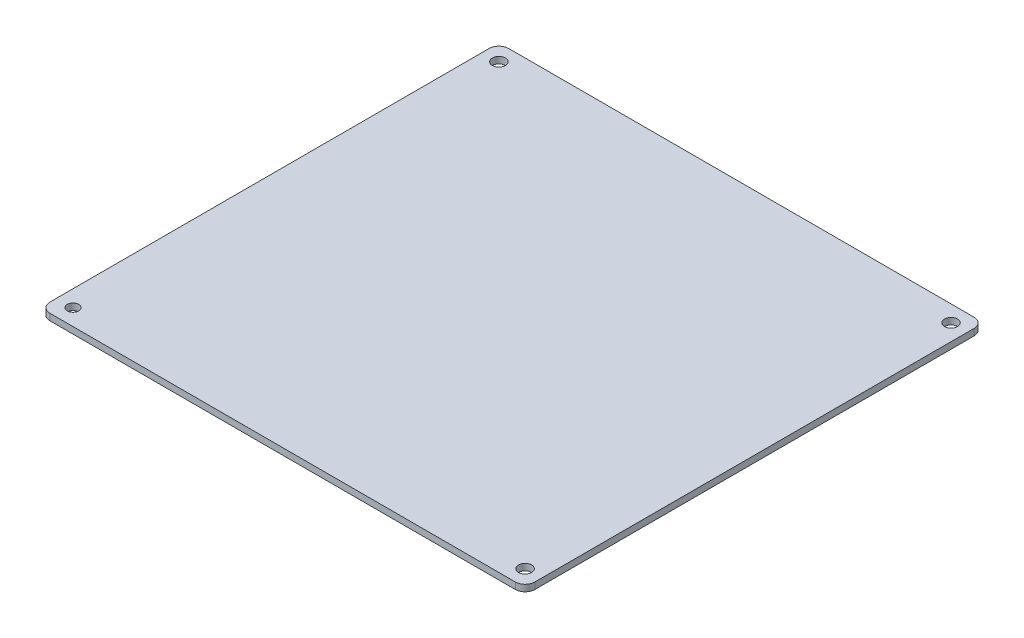
ISO-10303-21;
HEADER;
FILE_DESCRIPTION(('STEP AP214'),'2;1');
FILE_NAME('part.step','',(''),(''),'','','');
FILE_SCHEMA(('AUTOMOTIVE_DESIGN { 1 0 10303 214 1 1 1 1 }'));
ENDSEC;
DATA;
#1=APPLICATION_CONTEXT('core data for automotive mechanical design processes');
#2=APPLICATION_PROTOCOL_DEFINITION('international standard','automotive_design',2000,#1);
#3=PRODUCT_CONTEXT('',#1,'mechanical');
#4=PRODUCT('Part','Part','',(#3));
#5=PRODUCT_RELATED_PRODUCT_CATEGORY('part','',(#4));
#6=PRODUCT_DEFINITION_FORMATION('','',#4);
#7=PRODUCT_DEFINITION_CONTEXT('part definition',#1,'design');
#8=PRODUCT_DEFINITION('design','',#6,#7);
#9=PRODUCT_DEFINITION_SHAPE('','',#8);
#10=(LENGTH_UNIT() NAMED_UNIT(*) SI_UNIT(.MILLI.,.METRE.));
#11=(NAMED_UNIT(*) PLANE_ANGLE_UNIT() SI_UNIT($,.RADIAN.));
#12=(NAMED_UNIT(*) SI_UNIT($,.STERADIAN.) SOLID_ANGLE_UNIT());
#13=UNCERTAINTY_MEASURE_WITH_UNIT(LENGTH_MEASURE(1.E-05),#10,'distance_accuracy_value','');
#14=(GEOMETRIC_REPRESENTATION_CONTEXT(3) GLOBAL_UNCERTAINTY_ASSIGNED_CONTEXT((#13)) GLOBAL_UNIT_ASSIGNED_CONTEXT((#10,
#11,#12)) REPRESENTATION_CONTEXT('',''));
#15=CARTESIAN_POINT('',(0.,0.,0.));
#16=DIRECTION('',(0.,0.,1.));
#17=DIRECTION('',(1.,0.,0.));
#18=AXIS2_PLACEMENT_3D('',#15,#16,#17);
#19=CARTESIAN_POINT('',(86.9141470098578,2.,-137.76397382956));
#20=DIRECTION('',(-1.,0.,0.));
#21=DIRECTION('',(0.,0.,1.));
#22=AXIS2_PLACEMENT_3D('',#19,#20,#21);
#23=PLANE('',#22);
#24=DIRECTION('',(0.,0.,-1.));
#25=VECTOR('',#24,1.);
#26=CARTESIAN_POINT('',(86.9141470098578,0.,-137.76397382956));
#27=LINE('',#26,#25);
#28=CARTESIAN_POINT('',(86.9141470098578,0.,-0.763973829560338));
#29=VERTEX_POINT('',#28);
#30=CARTESIAN_POINT('',(86.9141470098578,0.,-134.76397382956));
#31=VERTEX_POINT('',#30);
#32=EDGE_CURVE('E119',#29,#31,#27,.T.);
#33=ORIENTED_EDGE('',*,*,#32,.T.);
#34=DIRECTION('',(0.,-1.,0.));
#35=VECTOR('',#34,1.);
#36=CARTESIAN_POINT('',(86.9141470098578,2.,-134.76397382956));
#37=LINE('',#36,#35);
#38=CARTESIAN_POINT('',(86.9141470098578,2.,-134.76397382956));
#39=VERTEX_POINT('',#38);
#40=EDGE_CURVE('E172',#31,#39,#37,.F.);
#41=ORIENTED_EDGE('',*,*,#40,.T.);
#42=DIRECTION('',(0.,0.,-1.));
#43=VECTOR('',#42,1.);
#44=CARTESIAN_POINT('',(86.9141470098578,2.,-137.76397382956));
#45=LINE('',#44,#43);
#46=CARTESIAN_POINT('',(86.9141470098578,2.,-0.763973829560338));
#47=VERTEX_POINT('',#46);
#48=EDGE_CURVE('E122',#47,#39,#45,.T.);
#49=ORIENTED_EDGE('',*,*,#48,.F.);
#50=DIRECTION('',(0.,-1.,0.));
#51=VECTOR('',#50,1.);
#52=CARTESIAN_POINT('',(86.9141470098578,2.,-0.763973829560338));
#53=LINE('',#52,#51);
#54=EDGE_CURVE('E110',#47,#29,#53,.T.);
#55=ORIENTED_EDGE('',*,*,#54,.T.);
#56=EDGE_LOOP('',(#33,#41,#49,#55));
#57=FACE_BOUND('',#56,.T.);
#58=ADVANCED_FACE('F39',(#57),#23,.F.);
#59=CARTESIAN_POINT('',(86.9141470098578,2.,-137.76397382956));
#60=DIRECTION('',(0.,0.,1.));
#61=DIRECTION('',(1.,0.,0.));
#62=AXIS2_PLACEMENT_3D('',#59,#60,#61);
#63=PLANE('',#62);
#64=DIRECTION('',(-1.,0.,0.));
#65=VECTOR('',#64,1.);
#66=CARTESIAN_POINT('',(86.9141470098578,0.,-137.76397382956));
#67=LINE('',#66,#65);
#68=CARTESIAN_POINT('',(83.9141470098578,0.,-137.76397382956));
#69=VERTEX_POINT('',#68);
#70=CARTESIAN_POINT('',(-58.0858529901422,0.,-137.76397382956));
#71=VERTEX_POINT('',#70);
#72=EDGE_CURVE('E130',#69,#71,#67,.T.);
#73=ORIENTED_EDGE('',*,*,#72,.T.);
#74=DIRECTION('',(0.,-1.,0.));
#75=VECTOR('',#74,1.);
#76=CARTESIAN_POINT('',(-58.0858529901422,2.,-137.76397382956));
#77=LINE('',#76,#75);
#78=CARTESIAN_POINT('',(-58.0858529901422,2.,-137.76397382956));
#79=VERTEX_POINT('',#78);
#80=EDGE_CURVE('E185',#71,#79,#77,.F.);
#81=ORIENTED_EDGE('',*,*,#80,.T.);
#82=DIRECTION('',(-1.,0.,0.));
#83=VECTOR('',#82,1.);
#84=CARTESIAN_POINT('',(86.9141470098578,2.,-137.76397382956));
#85=LINE('',#84,#83);
#86=CARTESIAN_POINT('',(83.9141470098578,2.,-137.76397382956));
#87=VERTEX_POINT('',#86);
#88=EDGE_CURVE('E201',#87,#79,#85,.T.);
#89=ORIENTED_EDGE('',*,*,#88,.F.);
#90=DIRECTION('',(0.,-1.,0.));
#91=VECTOR('',#90,1.);
#92=CARTESIAN_POINT('',(83.9141470098578,2.,-137.76397382956));
#93=LINE('',#92,#91);
#94=EDGE_CURVE('E166',#87,#69,#93,.T.);
#95=ORIENTED_EDGE('',*,*,#94,.T.);
#96=EDGE_LOOP('',(#73,#81,#89,#95));
#97=FACE_BOUND('',#96,.T.);
#98=ADVANCED_FACE('F247',(#97),#63,.F.);
#99=CARTESIAN_POINT('',(-61.0858529901422,2.,-137.76397382956));
#100=DIRECTION('',(1.,0.,0.));
#101=DIRECTION('',(0.,0.,-1.));
#102=AXIS2_PLACEMENT_3D('',#99,#100,#101);
#103=PLANE('',#102);
#104=DIRECTION('',(0.,0.,1.));
#105=VECTOR('',#104,1.);
#106=CARTESIAN_POINT('',(-61.0858529901422,0.,-137.76397382956));
#107=LINE('',#106,#105);
#108=CARTESIAN_POINT('',(-61.0858529901422,0.,-134.76397382956));
#109=VERTEX_POINT('',#108);
#110=CARTESIAN_POINT('',(-61.0858529901422,0.,-0.763973829560283));
#111=VERTEX_POINT('',#110);
#112=EDGE_CURVE('E136',#109,#111,#107,.T.);
#113=ORIENTED_EDGE('',*,*,#112,.T.);
#114=DIRECTION('',(0.,-1.,0.));
#115=VECTOR('',#114,1.);
#116=CARTESIAN_POINT('',(-61.0858529901422,2.,-0.763973829560283));
#117=LINE('',#116,#115);
#118=CARTESIAN_POINT('',(-61.0858529901422,2.,-0.763973829560283));
#119=VERTEX_POINT('',#118);
#120=EDGE_CURVE('E48',#111,#119,#117,.F.);
#121=ORIENTED_EDGE('',*,*,#120,.T.);
#122=DIRECTION('',(0.,0.,1.));
#123=VECTOR('',#122,1.);
#124=CARTESIAN_POINT('',(-61.0858529901422,2.,-137.76397382956));
#125=LINE('',#124,#123);
#126=CARTESIAN_POINT('',(-61.0858529901422,2.,-134.76397382956));
#127=VERTEX_POINT('',#126);
#128=EDGE_CURVE('E199',#127,#119,#125,.T.);
#129=ORIENTED_EDGE('',*,*,#128,.F.);
#130=DIRECTION('',(0.,-1.,0.));
#131=VECTOR('',#130,1.);
#132=CARTESIAN_POINT('',(-61.0858529901422,2.,-134.76397382956));
#133=LINE('',#132,#131);
#134=EDGE_CURVE('E178',#127,#109,#133,.T.);
#135=ORIENTED_EDGE('',*,*,#134,.T.);
#136=EDGE_LOOP('',(#113,#121,#129,#135));
#137=FACE_BOUND('',#136,.T.);
#138=ADVANCED_FACE('F242',(#137),#103,.F.);
#139=CARTESIAN_POINT('',(86.9141470098578,2.,2.23602617043966));
#140=DIRECTION('',(0.,0.,-1.));
#141=DIRECTION('',(-1.,0.,0.));
#142=AXIS2_PLACEMENT_3D('',#139,#140,#141);
#143=PLANE('',#142);
#144=DIRECTION('',(1.,0.,0.));
#145=VECTOR('',#144,1.);
#146=CARTESIAN_POINT('',(86.9141470098578,2.,2.23602617043966));
#147=LINE('',#146,#145);
#148=CARTESIAN_POINT('',(-58.0858529901422,2.,2.23602617043972));
#149=VERTEX_POINT('',#148);
#150=CARTESIAN_POINT('',(83.9141470098578,2.,2.23602617043967));
#151=VERTEX_POINT('',#150);
#152=EDGE_CURVE('E124',#149,#151,#147,.T.);
#153=ORIENTED_EDGE('',*,*,#152,.F.);
#154=DIRECTION('',(0.,-1.,0.));
#155=VECTOR('',#154,1.);
#156=CARTESIAN_POINT('',(-58.0858529901422,2.,2.23602617043972));
#157=LINE('',#156,#155);
#158=CARTESIAN_POINT('',(-58.0858529901422,0.,2.23602617043972));
#159=VERTEX_POINT('',#158);
#160=EDGE_CURVE('E191',#149,#159,#157,.T.);
#161=ORIENTED_EDGE('',*,*,#160,.T.);
#162=DIRECTION('',(1.,0.,0.));
#163=VECTOR('',#162,1.);
#164=CARTESIAN_POINT('',(86.9141470098578,0.,2.23602617043966));
#165=LINE('',#164,#163);
#166=CARTESIAN_POINT('',(83.9141470098578,0.,2.23602617043967));
#167=VERTEX_POINT('',#166);
#168=EDGE_CURVE('E146',#159,#167,#165,.T.);
#169=ORIENTED_EDGE('',*,*,#168,.T.);
#170=DIRECTION('',(0.,-1.,0.));
#171=VECTOR('',#170,1.);
#172=CARTESIAN_POINT('',(83.9141470098578,2.,2.23602617043967));
#173=LINE('',#172,#171);
#174=EDGE_CURVE('E112',#167,#151,#173,.F.);
#175=ORIENTED_EDGE('',*,*,#174,.T.);
#176=EDGE_LOOP('',(#153,#161,#169,#175));
#177=FACE_BOUND('',#176,.T.);
#178=ADVANCED_FACE('F230',(#177),#143,.F.);
#179=CARTESIAN_POINT('',(0.,2.,0.));
#180=DIRECTION('',(0.,-1.,0.));
#181=DIRECTION('',(0.,0.,-1.));
#182=AXIS2_PLACEMENT_3D('',#179,#180,#181);
#183=PLANE('',#182);
#184=CARTESIAN_POINT('',(-56.0858529901422,2.,-2.76397382956028));
#185=DIRECTION('',(0.,1.,0.));
#186=DIRECTION('',(0.,0.,1.));
#187=AXIS2_PLACEMENT_3D('',#184,#185,#186);
#188=CIRCLE('',#187,1.73874997043389);
#189=CARTESIAN_POINT('',(-56.0858529901422,2.,-1.02522385912639));
#190=VERTEX_POINT('',#189);
#191=EDGE_CURVE('E213',#190,#190,#188,.T.);
#192=ORIENTED_EDGE('',*,*,#191,.F.);
#193=EDGE_LOOP('',(#192));
#194=FACE_BOUND('',#193,.T.);
#195=CARTESIAN_POINT('',(81.9141470098578,2.,-2.76397382956028));
#196=DIRECTION('',(0.,1.,0.));
#197=DIRECTION('',(0.,0.,1.));
#198=AXIS2_PLACEMENT_3D('',#195,#196,#197);
#199=CIRCLE('',#198,2.);
#200=CARTESIAN_POINT('',(81.9141470098578,2.,-0.763973829560284));
#201=VERTEX_POINT('',#200);
#202=EDGE_CURVE('E217',#201,#201,#199,.T.);
#203=ORIENTED_EDGE('',*,*,#202,.F.);
#204=EDGE_LOOP('',(#203));
#205=FACE_BOUND('',#204,.T.);
#206=CARTESIAN_POINT('',(81.9141470098578,2.,-132.76397382956));
#207=DIRECTION('',(0.,1.,0.));
#208=DIRECTION('',(0.,0.,1.));
#209=AXIS2_PLACEMENT_3D('',#206,#207,#208);
#210=CIRCLE('',#209,2.);
#211=CARTESIAN_POINT('',(81.9141470098578,2.,-130.76397382956));
#212=VERTEX_POINT('',#211);
#213=EDGE_CURVE('E212',#212,#212,#210,.T.);
#214=ORIENTED_EDGE('',*,*,#213,.F.);
#215=EDGE_LOOP('',(#214));
#216=FACE_BOUND('',#215,.T.);
#217=CARTESIAN_POINT('',(-56.0858529901422,2.,-132.76397382956));
#218=DIRECTION('',(0.,1.,0.));
#219=DIRECTION('',(0.,0.,1.));
#220=AXIS2_PLACEMENT_3D('',#217,#218,#219);
#221=CIRCLE('',#220,2.);
#222=CARTESIAN_POINT('',(-56.0858529901422,2.,-130.76397382956));
#223=VERTEX_POINT('',#222);
#224=EDGE_CURVE('E154',#223,#223,#221,.T.);
#225=ORIENTED_EDGE('',*,*,#224,.F.);
#226=EDGE_LOOP('',(#225));
#227=FACE_BOUND('',#226,.T.);
#228=ORIENTED_EDGE('',*,*,#128,.T.);
#229=CARTESIAN_POINT('',(-58.0858529901422,2.,-0.763973829560281));
#230=DIRECTION('',(0.,-1.,0.));
#231=DIRECTION('',(0.,0.,-1.));
#232=AXIS2_PLACEMENT_3D('',#229,#230,#231);
#233=CIRCLE('',#232,3.);
#234=EDGE_CURVE('E11',#119,#149,#233,.F.);
#235=ORIENTED_EDGE('',*,*,#234,.T.);
#236=ORIENTED_EDGE('',*,*,#152,.T.);
#237=CARTESIAN_POINT('',(83.9141470098578,2.,-0.763973829560338));
#238=DIRECTION('',(0.,-1.,0.));
#239=DIRECTION('',(0.,0.,-1.));
#240=AXIS2_PLACEMENT_3D('',#237,#238,#239);
#241=CIRCLE('',#240,3.);
#242=EDGE_CURVE('E163',#151,#47,#241,.F.);
#243=ORIENTED_EDGE('',*,*,#242,.T.);
#244=ORIENTED_EDGE('',*,*,#48,.T.);
#245=CARTESIAN_POINT('',(83.9141470098578,2.,-134.76397382956));
#246=DIRECTION('',(0.,-1.,0.));
#247=DIRECTION('',(0.,0.,-1.));
#248=AXIS2_PLACEMENT_3D('',#245,#246,#247);
#249=CIRCLE('',#248,3.);
#250=EDGE_CURVE('E175',#39,#87,#249,.F.);
#251=ORIENTED_EDGE('',*,*,#250,.T.);
#252=ORIENTED_EDGE('',*,*,#88,.T.);
#253=CARTESIAN_POINT('',(-58.0858529901422,2.,-134.76397382956));
#254=DIRECTION('',(0.,-1.,0.));
#255=DIRECTION('',(0.,0.,-1.));
#256=AXIS2_PLACEMENT_3D('',#253,#254,#255);
#257=CIRCLE('',#256,3.);
#258=EDGE_CURVE('E188',#79,#127,#257,.F.);
#259=ORIENTED_EDGE('',*,*,#258,.T.);
#260=EDGE_LOOP('',(#228,#235,#236,#243,#244,#251,#252,#259));
#261=FACE_BOUND('',#260,.T.);
#262=ADVANCED_FACE('F227',(#194,#205,#216,#227,#261),#183,.F.);
#263=CARTESIAN_POINT('',(0.,0.,0.));
#264=DIRECTION('',(0.,-1.,0.));
#265=DIRECTION('',(0.,0.,-1.));
#266=AXIS2_PLACEMENT_3D('',#263,#264,#265);
#267=PLANE('',#266);
#268=CARTESIAN_POINT('',(-56.0858529901422,0.,-2.76397382956028));
#269=DIRECTION('',(0.,-1.,0.));
#270=DIRECTION('',(0.,0.,-1.));
#271=AXIS2_PLACEMENT_3D('',#268,#269,#270);
#272=CIRCLE('',#271,1.73874997043389);
#273=CARTESIAN_POINT('',(-56.0858529901422,0.,-4.50272379999417));
#274=VERTEX_POINT('',#273);
#275=EDGE_CURVE('E131',#274,#274,#272,.T.);
#276=ORIENTED_EDGE('',*,*,#275,.F.);
#277=EDGE_LOOP('',(#276));
#278=FACE_BOUND('',#277,.T.);
#279=CARTESIAN_POINT('',(81.9141470098578,0.,-2.76397382956028));
#280=DIRECTION('',(0.,-1.,0.));
#281=DIRECTION('',(0.,0.,-1.));
#282=AXIS2_PLACEMENT_3D('',#279,#280,#281);
#283=CIRCLE('',#282,2.);
#284=CARTESIAN_POINT('',(81.9141470098578,0.,-4.76397382956028));
#285=VERTEX_POINT('',#284);
#286=EDGE_CURVE('E139',#285,#285,#283,.T.);
#287=ORIENTED_EDGE('',*,*,#286,.F.);
#288=EDGE_LOOP('',(#287));
#289=FACE_BOUND('',#288,.T.);
#290=CARTESIAN_POINT('',(81.9141470098578,0.,-132.76397382956));
#291=DIRECTION('',(0.,-1.,0.));
#292=DIRECTION('',(0.,0.,-1.));
#293=AXIS2_PLACEMENT_3D('',#290,#291,#292);
#294=CIRCLE('',#293,2.);
#295=CARTESIAN_POINT('',(81.9141470098578,0.,-134.76397382956));
#296=VERTEX_POINT('',#295);
#297=EDGE_CURVE('E153',#296,#296,#294,.T.);
#298=ORIENTED_EDGE('',*,*,#297,.F.);
#299=EDGE_LOOP('',(#298));
#300=FACE_BOUND('',#299,.T.);
#301=CARTESIAN_POINT('',(-56.0858529901422,0.,-132.76397382956));
#302=DIRECTION('',(0.,-1.,0.));
#303=DIRECTION('',(0.,0.,-1.));
#304=AXIS2_PLACEMENT_3D('',#301,#302,#303);
#305=CIRCLE('',#304,2.);
#306=CARTESIAN_POINT('',(-56.0858529901422,0.,-134.76397382956));
#307=VERTEX_POINT('',#306);
#308=EDGE_CURVE('E149',#307,#307,#305,.T.);
#309=ORIENTED_EDGE('',*,*,#308,.F.);
#310=EDGE_LOOP('',(#309));
#311=FACE_BOUND('',#310,.T.);
#312=ORIENTED_EDGE('',*,*,#168,.F.);
#313=CARTESIAN_POINT('',(-58.0858529901422,0.,-0.763973829560281));
#314=DIRECTION('',(0.,-1.,0.));
#315=DIRECTION('',(0.,0.,-1.));
#316=AXIS2_PLACEMENT_3D('',#313,#314,#315);
#317=CIRCLE('',#316,3.);
#318=EDGE_CURVE('E62',#159,#111,#317,.T.);
#319=ORIENTED_EDGE('',*,*,#318,.T.);
#320=ORIENTED_EDGE('',*,*,#112,.F.);
#321=CARTESIAN_POINT('',(-58.0858529901422,0.,-134.76397382956));
#322=DIRECTION('',(0.,-1.,0.));
#323=DIRECTION('',(0.,0.,-1.));
#324=AXIS2_PLACEMENT_3D('',#321,#322,#323);
#325=CIRCLE('',#324,3.);
#326=EDGE_CURVE('E182',#109,#71,#325,.T.);
#327=ORIENTED_EDGE('',*,*,#326,.T.);
#328=ORIENTED_EDGE('',*,*,#72,.F.);
#329=CARTESIAN_POINT('',(83.9141470098578,0.,-134.76397382956));
#330=DIRECTION('',(0.,-1.,0.));
#331=DIRECTION('',(0.,0.,-1.));
#332=AXIS2_PLACEMENT_3D('',#329,#330,#331);
#333=CIRCLE('',#332,3.);
#334=EDGE_CURVE('E128',#69,#31,#333,.T.);
#335=ORIENTED_EDGE('',*,*,#334,.T.);
#336=ORIENTED_EDGE('',*,*,#32,.F.);
#337=CARTESIAN_POINT('',(83.9141470098578,0.,-0.763973829560338));
#338=DIRECTION('',(0.,-1.,0.));
#339=DIRECTION('',(0.,0.,-1.));
#340=AXIS2_PLACEMENT_3D('',#337,#338,#339);
#341=CIRCLE('',#340,3.);
#342=EDGE_CURVE('E106',#29,#167,#341,.T.);
#343=ORIENTED_EDGE('',*,*,#342,.T.);
#344=EDGE_LOOP('',(#312,#319,#320,#327,#328,#335,#336,#343));
#345=FACE_BOUND('',#344,.T.);
#346=ADVANCED_FACE('F126',(#278,#289,#300,#311,#345),#267,.T.);
#347=CARTESIAN_POINT('',(-56.0858529901422,-3.,-132.76397382956));
#348=DIRECTION('',(0.,1.,0.));
#349=DIRECTION('',(0.,0.,1.));
#350=AXIS2_PLACEMENT_3D('',#347,#348,#349);
#351=CYLINDRICAL_SURFACE('',#350,2.);
#352=ORIENTED_EDGE('',*,*,#308,.T.);
#353=EDGE_LOOP('',(#352));
#354=FACE_BOUND('',#353,.T.);
#355=ORIENTED_EDGE('',*,*,#224,.T.);
#356=EDGE_LOOP('',(#355));
#357=FACE_BOUND('',#356,.T.);
#358=ADVANCED_FACE('F285',(#354,#357),#351,.F.);
#359=CARTESIAN_POINT('',(81.9141470098578,-3.,-132.76397382956));
#360=DIRECTION('',(0.,1.,0.));
#361=DIRECTION('',(0.,0.,1.));
#362=AXIS2_PLACEMENT_3D('',#359,#360,#361);
#363=CYLINDRICAL_SURFACE('',#362,2.);
#364=ORIENTED_EDGE('',*,*,#297,.T.);
#365=EDGE_LOOP('',(#364));
#366=FACE_BOUND('',#365,.T.);
#367=ORIENTED_EDGE('',*,*,#213,.T.);
#368=EDGE_LOOP('',(#367));
#369=FACE_BOUND('',#368,.T.);
#370=ADVANCED_FACE('F225',(#366,#369),#363,.F.);
#371=CARTESIAN_POINT('',(81.9141470098578,-3.,-2.76397382956028));
#372=DIRECTION('',(0.,1.,0.));
#373=DIRECTION('',(0.,0.,1.));
#374=AXIS2_PLACEMENT_3D('',#371,#372,#373);
#375=CYLINDRICAL_SURFACE('',#374,2.);
#376=ORIENTED_EDGE('',*,*,#286,.T.);
#377=EDGE_LOOP('',(#376));
#378=FACE_BOUND('',#377,.T.);
#379=ORIENTED_EDGE('',*,*,#202,.T.);
#380=EDGE_LOOP('',(#379));
#381=FACE_BOUND('',#380,.T.);
#382=ADVANCED_FACE('F337',(#378,#381),#375,.F.);
#383=CARTESIAN_POINT('',(-56.0858529901422,-3.,-2.76397382956028));
#384=DIRECTION('',(0.,1.,0.));
#385=DIRECTION('',(0.,0.,1.));
#386=AXIS2_PLACEMENT_3D('',#383,#384,#385);
#387=CYLINDRICAL_SURFACE('',#386,1.73874997043389);
#388=ORIENTED_EDGE('',*,*,#275,.T.);
#389=EDGE_LOOP('',(#388));
#390=FACE_BOUND('',#389,.T.);
#391=ORIENTED_EDGE('',*,*,#191,.T.);
#392=EDGE_LOOP('',(#391));
#393=FACE_BOUND('',#392,.T.);
#394=ADVANCED_FACE('F261',(#390,#393),#387,.F.);
#395=CARTESIAN_POINT('',(83.9141470098578,2.,-0.763973829560338));
#396=DIRECTION('',(0.,-1.,0.));
#397=DIRECTION('',(0.,0.,-1.));
#398=AXIS2_PLACEMENT_3D('',#395,#396,#397);
#399=CYLINDRICAL_SURFACE('',#398,3.);
#400=ORIENTED_EDGE('',*,*,#242,.F.);
#401=ORIENTED_EDGE('',*,*,#174,.F.);
#402=ORIENTED_EDGE('',*,*,#342,.F.);
#403=ORIENTED_EDGE('',*,*,#54,.F.);
#404=EDGE_LOOP('',(#400,#401,#402,#403));
#405=FACE_BOUND('',#404,.T.);
#406=ADVANCED_FACE('F109',(#405),#399,.T.);
#407=CARTESIAN_POINT('',(83.9141470098578,2.,-134.76397382956));
#408=DIRECTION('',(0.,-1.,0.));
#409=DIRECTION('',(0.,0.,-1.));
#410=AXIS2_PLACEMENT_3D('',#407,#408,#409);
#411=CYLINDRICAL_SURFACE('',#410,3.);
#412=ORIENTED_EDGE('',*,*,#250,.F.);
#413=ORIENTED_EDGE('',*,*,#40,.F.);
#414=ORIENTED_EDGE('',*,*,#334,.F.);
#415=ORIENTED_EDGE('',*,*,#94,.F.);
#416=EDGE_LOOP('',(#412,#413,#414,#415));
#417=FACE_BOUND('',#416,.T.);
#418=ADVANCED_FACE('F260',(#417),#411,.T.);
#419=CARTESIAN_POINT('',(-58.0858529901422,2.,-134.76397382956));
#420=DIRECTION('',(0.,-1.,0.));
#421=DIRECTION('',(0.,0.,-1.));
#422=AXIS2_PLACEMENT_3D('',#419,#420,#421);
#423=CYLINDRICAL_SURFACE('',#422,3.);
#424=ORIENTED_EDGE('',*,*,#258,.F.);
#425=ORIENTED_EDGE('',*,*,#80,.F.);
#426=ORIENTED_EDGE('',*,*,#326,.F.);
#427=ORIENTED_EDGE('',*,*,#134,.F.);
#428=EDGE_LOOP('',(#424,#425,#426,#427));
#429=FACE_BOUND('',#428,.T.);
#430=ADVANCED_FACE('F263',(#429),#423,.T.);
#431=CARTESIAN_POINT('',(-58.0858529901422,2.,-0.763973829560281));
#432=DIRECTION('',(0.,-1.,0.));
#433=DIRECTION('',(0.,0.,-1.));
#434=AXIS2_PLACEMENT_3D('',#431,#432,#433);
#435=CYLINDRICAL_SURFACE('',#434,3.);
#436=ORIENTED_EDGE('',*,*,#234,.F.);
#437=ORIENTED_EDGE('',*,*,#120,.F.);
#438=ORIENTED_EDGE('',*,*,#318,.F.);
#439=ORIENTED_EDGE('',*,*,#160,.F.);
#440=EDGE_LOOP('',(#436,#437,#438,#439));
#441=FACE_BOUND('',#440,.T.);
#442=ADVANCED_FACE('F41',(#441),#435,.T.);
#443=CLOSED_SHELL('',(#58,#98,#138,#178,#262,#346,#358,#370,#382,#394,#406,#418,#430,#442));
#444=MANIFOLD_SOLID_BREP('B2',#443);
#445=ADVANCED_BREP_SHAPE_REPRESENTATION('',(#18,#444),#14);
#446=SHAPE_DEFINITION_REPRESENTATION(#9,#445);
ENDSEC;
END-ISO-10303-21;
